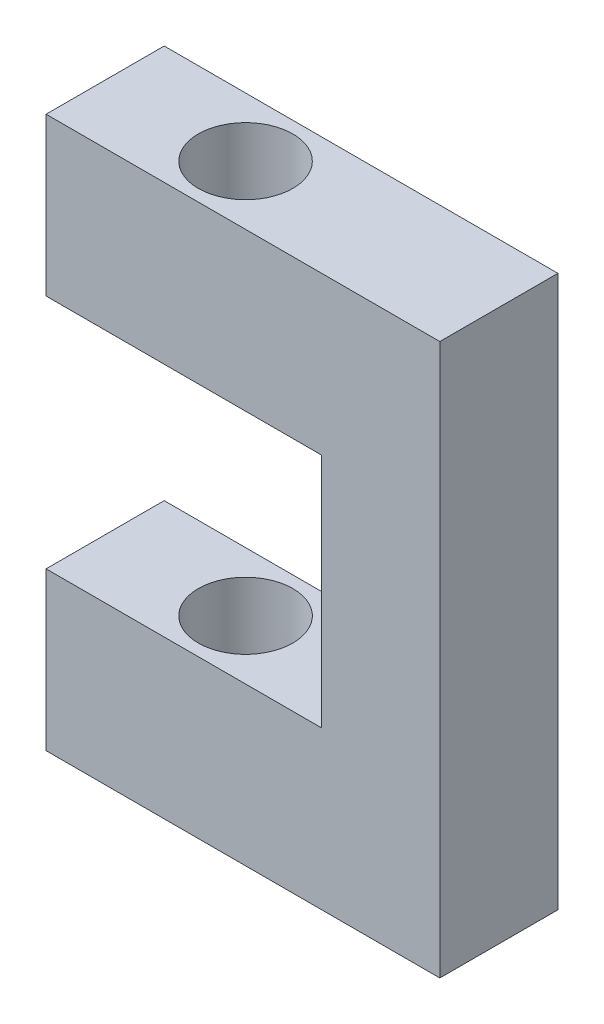
ISO-10303-21;
HEADER;
FILE_DESCRIPTION(('STEP AP214'),'2;1');
FILE_NAME('part.step','',(''),(''),'','','');
FILE_SCHEMA(('AUTOMOTIVE_DESIGN { 1 0 10303 214 1 1 1 1 }'));
ENDSEC;
DATA;
#1=APPLICATION_CONTEXT('core data for automotive mechanical design processes');
#2=APPLICATION_PROTOCOL_DEFINITION('international standard','automotive_design',2000,#1);
#3=PRODUCT_CONTEXT('',#1,'mechanical');
#4=PRODUCT('Part','Part','',(#3));
#5=PRODUCT_RELATED_PRODUCT_CATEGORY('part','',(#4));
#6=PRODUCT_DEFINITION_FORMATION('','',#4);
#7=PRODUCT_DEFINITION_CONTEXT('part definition',#1,'design');
#8=PRODUCT_DEFINITION('design','',#6,#7);
#9=PRODUCT_DEFINITION_SHAPE('','',#8);
#10=(LENGTH_UNIT() NAMED_UNIT(*) SI_UNIT(.MILLI.,.METRE.));
#11=(NAMED_UNIT(*) PLANE_ANGLE_UNIT() SI_UNIT($,.RADIAN.));
#12=(NAMED_UNIT(*) SI_UNIT($,.STERADIAN.) SOLID_ANGLE_UNIT());
#13=UNCERTAINTY_MEASURE_WITH_UNIT(LENGTH_MEASURE(1.E-05),#10,'distance_accuracy_value','');
#14=(GEOMETRIC_REPRESENTATION_CONTEXT(3) GLOBAL_UNCERTAINTY_ASSIGNED_CONTEXT((#13)) GLOBAL_UNIT_ASSIGNED_CONTEXT((#10,
#11,#12)) REPRESENTATION_CONTEXT('',''));
#15=CARTESIAN_POINT('',(0.,0.,0.));
#16=DIRECTION('',(0.,0.,1.));
#17=DIRECTION('',(1.,0.,0.));
#18=AXIS2_PLACEMENT_3D('',#15,#16,#17);
#19=CARTESIAN_POINT('',(0.,0.,15.));
#20=DIRECTION('',(1.,0.,0.));
#21=DIRECTION('',(0.,1.,0.));
#22=AXIS2_PLACEMENT_3D('',#19,#20,#21);
#23=PLANE('',#22);
#24=DIRECTION('',(0.,-1.,0.));
#25=VECTOR('',#24,1.);
#26=CARTESIAN_POINT('',(0.,0.,0.));
#27=LINE('',#26,#25);
#28=CARTESIAN_POINT('',(0.,0.,0.));
#29=VERTEX_POINT('',#28);
#30=CARTESIAN_POINT('',(0.,-20.,0.));
#31=VERTEX_POINT('',#30);
#32=EDGE_CURVE('E129',#29,#31,#27,.T.);
#33=ORIENTED_EDGE('',*,*,#32,.T.);
#34=DIRECTION('',(0.,0.,-1.));
#35=VECTOR('',#34,1.);
#36=CARTESIAN_POINT('',(0.,-20.,15.));
#37=LINE('',#36,#35);
#38=CARTESIAN_POINT('',(0.,-20.,15.));
#39=VERTEX_POINT('',#38);
#40=EDGE_CURVE('E11',#39,#31,#37,.T.);
#41=ORIENTED_EDGE('',*,*,#40,.F.);
#42=DIRECTION('',(0.,-1.,0.));
#43=VECTOR('',#42,1.);
#44=CARTESIAN_POINT('',(0.,0.,15.));
#45=LINE('',#44,#43);
#46=CARTESIAN_POINT('',(0.,0.,15.));
#47=VERTEX_POINT('',#46);
#48=EDGE_CURVE('E144',#47,#39,#45,.T.);
#49=ORIENTED_EDGE('',*,*,#48,.F.);
#50=DIRECTION('',(0.,0.,-1.));
#51=VECTOR('',#50,1.);
#52=CARTESIAN_POINT('',(0.,0.,15.));
#53=LINE('',#52,#51);
#54=EDGE_CURVE('E125',#47,#29,#53,.T.);
#55=ORIENTED_EDGE('',*,*,#54,.T.);
#56=EDGE_LOOP('',(#33,#41,#49,#55));
#57=FACE_BOUND('',#56,.T.);
#58=ADVANCED_FACE('F33',(#57),#23,.F.);
#59=CARTESIAN_POINT('',(0.,-20.,15.));
#60=DIRECTION('',(0.,1.,0.));
#61=DIRECTION('',(0.,0.,1.));
#62=AXIS2_PLACEMENT_3D('',#59,#60,#61);
#63=PLANE('',#62);
#64=CARTESIAN_POINT('',(17.8319150181423,-20.,7.5));
#65=DIRECTION('',(0.,1.,0.));
#66=DIRECTION('',(0.,0.,1.));
#67=AXIS2_PLACEMENT_3D('',#64,#65,#66);
#68=CIRCLE('',#67,6.);
#69=CARTESIAN_POINT('',(17.8319150181423,-20.,13.5));
#70=VERTEX_POINT('',#69);
#71=EDGE_CURVE('E133',#70,#70,#68,.T.);
#72=ORIENTED_EDGE('',*,*,#71,.T.);
#73=EDGE_LOOP('',(#72));
#74=FACE_BOUND('',#73,.T.);
#75=DIRECTION('',(1.,0.,0.));
#76=VECTOR('',#75,1.);
#77=CARTESIAN_POINT('',(0.,-20.,0.));
#78=LINE('',#77,#76);
#79=CARTESIAN_POINT('',(35.,-20.,0.));
#80=VERTEX_POINT('',#79);
#81=EDGE_CURVE('E132',#31,#80,#78,.T.);
#82=ORIENTED_EDGE('',*,*,#81,.T.);
#83=DIRECTION('',(0.,0.,-1.));
#84=VECTOR('',#83,1.);
#85=CARTESIAN_POINT('',(35.,-20.,15.));
#86=LINE('',#85,#84);
#87=CARTESIAN_POINT('',(35.,-20.,15.));
#88=VERTEX_POINT('',#87);
#89=EDGE_CURVE('E41',#88,#80,#86,.T.);
#90=ORIENTED_EDGE('',*,*,#89,.F.);
#91=DIRECTION('',(1.,0.,0.));
#92=VECTOR('',#91,1.);
#93=CARTESIAN_POINT('',(0.,-20.,15.));
#94=LINE('',#93,#92);
#95=EDGE_CURVE('E92',#39,#88,#94,.T.);
#96=ORIENTED_EDGE('',*,*,#95,.F.);
#97=ORIENTED_EDGE('',*,*,#40,.T.);
#98=EDGE_LOOP('',(#82,#90,#96,#97));
#99=FACE_BOUND('',#98,.T.);
#100=ADVANCED_FACE('F203',(#74,#99),#63,.F.);
#101=CARTESIAN_POINT('',(35.,-20.,15.));
#102=DIRECTION('',(1.,0.,0.));
#103=DIRECTION('',(0.,0.,-1.));
#104=AXIS2_PLACEMENT_3D('',#101,#102,#103);
#105=PLANE('',#104);
#106=DIRECTION('',(0.,-1.,0.));
#107=VECTOR('',#106,1.);
#108=CARTESIAN_POINT('',(35.,-20.,0.));
#109=LINE('',#108,#107);
#110=CARTESIAN_POINT('',(35.,-50.,0.));
#111=VERTEX_POINT('',#110);
#112=EDGE_CURVE('E135',#80,#111,#109,.T.);
#113=ORIENTED_EDGE('',*,*,#112,.T.);
#114=DIRECTION('',(0.,0.,-1.));
#115=VECTOR('',#114,1.);
#116=CARTESIAN_POINT('',(35.,-50.,15.));
#117=LINE('',#116,#115);
#118=CARTESIAN_POINT('',(35.,-50.,15.));
#119=VERTEX_POINT('',#118);
#120=EDGE_CURVE('E151',#119,#111,#117,.T.);
#121=ORIENTED_EDGE('',*,*,#120,.F.);
#122=DIRECTION('',(0.,-1.,0.));
#123=VECTOR('',#122,1.);
#124=CARTESIAN_POINT('',(35.,-20.,15.));
#125=LINE('',#124,#123);
#126=EDGE_CURVE('E159',#88,#119,#125,.T.);
#127=ORIENTED_EDGE('',*,*,#126,.F.);
#128=ORIENTED_EDGE('',*,*,#89,.T.);
#129=EDGE_LOOP('',(#113,#121,#127,#128));
#130=FACE_BOUND('',#129,.T.);
#131=ADVANCED_FACE('F157',(#130),#105,.F.);
#132=CARTESIAN_POINT('',(35.,-50.,15.));
#133=DIRECTION('',(0.,-1.,0.));
#134=DIRECTION('',(1.,0.,0.));
#135=AXIS2_PLACEMENT_3D('',#132,#133,#134);
#136=PLANE('',#135);
#137=CARTESIAN_POINT('',(17.8319150181423,-50.,7.5));
#138=DIRECTION('',(0.,-1.,0.));
#139=DIRECTION('',(1.,0.,0.));
#140=AXIS2_PLACEMENT_3D('',#137,#138,#139);
#141=CIRCLE('',#140,6.);
#142=CARTESIAN_POINT('',(23.8319150181423,-50.,7.5));
#143=VERTEX_POINT('',#142);
#144=EDGE_CURVE('E179',#143,#143,#141,.T.);
#145=ORIENTED_EDGE('',*,*,#144,.T.);
#146=EDGE_LOOP('',(#145));
#147=FACE_BOUND('',#146,.T.);
#148=DIRECTION('',(-1.,0.,0.));
#149=VECTOR('',#148,1.);
#150=CARTESIAN_POINT('',(35.,-50.,0.));
#151=LINE('',#150,#149);
#152=CARTESIAN_POINT('',(0.,-50.,0.));
#153=VERTEX_POINT('',#152);
#154=EDGE_CURVE('E137',#111,#153,#151,.T.);
#155=ORIENTED_EDGE('',*,*,#154,.T.);
#156=DIRECTION('',(0.,0.,-1.));
#157=VECTOR('',#156,1.);
#158=CARTESIAN_POINT('',(0.,-50.,15.));
#159=LINE('',#158,#157);
#160=CARTESIAN_POINT('',(0.,-50.,15.));
#161=VERTEX_POINT('',#160);
#162=EDGE_CURVE('E148',#161,#153,#159,.T.);
#163=ORIENTED_EDGE('',*,*,#162,.F.);
#164=DIRECTION('',(-1.,0.,0.));
#165=VECTOR('',#164,1.);
#166=CARTESIAN_POINT('',(35.,-50.,15.));
#167=LINE('',#166,#165);
#168=EDGE_CURVE('E171',#119,#161,#167,.T.);
#169=ORIENTED_EDGE('',*,*,#168,.F.);
#170=ORIENTED_EDGE('',*,*,#120,.T.);
#171=EDGE_LOOP('',(#155,#163,#169,#170));
#172=FACE_BOUND('',#171,.T.);
#173=ADVANCED_FACE('F167',(#147,#172),#136,.F.);
#174=CARTESIAN_POINT('',(0.,-50.,15.));
#175=DIRECTION('',(1.,0.,0.));
#176=DIRECTION('',(0.,1.,0.));
#177=AXIS2_PLACEMENT_3D('',#174,#175,#176);
#178=PLANE('',#177);
#179=DIRECTION('',(0.,-1.,0.));
#180=VECTOR('',#179,1.);
#181=CARTESIAN_POINT('',(0.,-50.,0.));
#182=LINE('',#181,#180);
#183=CARTESIAN_POINT('',(0.,-70.,0.));
#184=VERTEX_POINT('',#183);
#185=EDGE_CURVE('E139',#153,#184,#182,.T.);
#186=ORIENTED_EDGE('',*,*,#185,.T.);
#187=DIRECTION('',(0.,0.,-1.));
#188=VECTOR('',#187,1.);
#189=CARTESIAN_POINT('',(0.,-70.,15.));
#190=LINE('',#189,#188);
#191=CARTESIAN_POINT('',(0.,-70.,15.));
#192=VERTEX_POINT('',#191);
#193=EDGE_CURVE('E120',#192,#184,#190,.T.);
#194=ORIENTED_EDGE('',*,*,#193,.F.);
#195=DIRECTION('',(0.,-1.,0.));
#196=VECTOR('',#195,1.);
#197=CARTESIAN_POINT('',(0.,-50.,15.));
#198=LINE('',#197,#196);
#199=EDGE_CURVE('E111',#161,#192,#198,.T.);
#200=ORIENTED_EDGE('',*,*,#199,.F.);
#201=ORIENTED_EDGE('',*,*,#162,.T.);
#202=EDGE_LOOP('',(#186,#194,#200,#201));
#203=FACE_BOUND('',#202,.T.);
#204=ADVANCED_FACE('F170',(#203),#178,.F.);
#205=CARTESIAN_POINT('',(50.,-70.,15.));
#206=DIRECTION('',(0.,1.,0.));
#207=DIRECTION('',(-1.,0.,0.));
#208=AXIS2_PLACEMENT_3D('',#205,#206,#207);
#209=PLANE('',#208);
#210=CARTESIAN_POINT('',(17.8319150181423,-70.,7.5));
#211=DIRECTION('',(0.,1.,0.));
#212=DIRECTION('',(-1.,0.,0.));
#213=AXIS2_PLACEMENT_3D('',#210,#211,#212);
#214=CIRCLE('',#213,6.);
#215=CARTESIAN_POINT('',(11.8319150181423,-70.,7.5));
#216=VERTEX_POINT('',#215);
#217=EDGE_CURVE('E182',#216,#216,#214,.T.);
#218=ORIENTED_EDGE('',*,*,#217,.T.);
#219=EDGE_LOOP('',(#218));
#220=FACE_BOUND('',#219,.T.);
#221=DIRECTION('',(1.,0.,0.));
#222=VECTOR('',#221,1.);
#223=CARTESIAN_POINT('',(50.,-70.,0.));
#224=LINE('',#223,#222);
#225=CARTESIAN_POINT('',(50.,-70.,0.));
#226=VERTEX_POINT('',#225);
#227=EDGE_CURVE('E119',#184,#226,#224,.T.);
#228=ORIENTED_EDGE('',*,*,#227,.T.);
#229=DIRECTION('',(0.,0.,-1.));
#230=VECTOR('',#229,1.);
#231=CARTESIAN_POINT('',(50.,-70.,15.));
#232=LINE('',#231,#230);
#233=CARTESIAN_POINT('',(50.,-70.,15.));
#234=VERTEX_POINT('',#233);
#235=EDGE_CURVE('E116',#234,#226,#232,.T.);
#236=ORIENTED_EDGE('',*,*,#235,.F.);
#237=DIRECTION('',(1.,0.,0.));
#238=VECTOR('',#237,1.);
#239=CARTESIAN_POINT('',(50.,-70.,15.));
#240=LINE('',#239,#238);
#241=EDGE_CURVE('E105',#192,#234,#240,.T.);
#242=ORIENTED_EDGE('',*,*,#241,.F.);
#243=ORIENTED_EDGE('',*,*,#193,.T.);
#244=EDGE_LOOP('',(#228,#236,#242,#243));
#245=FACE_BOUND('',#244,.T.);
#246=ADVANCED_FACE('F117',(#220,#245),#209,.F.);
#247=CARTESIAN_POINT('',(50.,0.,15.));
#248=DIRECTION('',(-1.,0.,0.));
#249=DIRECTION('',(0.,0.,1.));
#250=AXIS2_PLACEMENT_3D('',#247,#248,#249);
#251=PLANE('',#250);
#252=DIRECTION('',(0.,1.,0.));
#253=VECTOR('',#252,1.);
#254=CARTESIAN_POINT('',(50.,0.,0.));
#255=LINE('',#254,#253);
#256=CARTESIAN_POINT('',(50.,0.,0.));
#257=VERTEX_POINT('',#256);
#258=EDGE_CURVE('E78',#226,#257,#255,.T.);
#259=ORIENTED_EDGE('',*,*,#258,.T.);
#260=DIRECTION('',(0.,0.,-1.));
#261=VECTOR('',#260,1.);
#262=CARTESIAN_POINT('',(50.,0.,15.));
#263=LINE('',#262,#261);
#264=CARTESIAN_POINT('',(50.,0.,15.));
#265=VERTEX_POINT('',#264);
#266=EDGE_CURVE('E121',#265,#257,#263,.T.);
#267=ORIENTED_EDGE('',*,*,#266,.F.);
#268=DIRECTION('',(0.,1.,0.));
#269=VECTOR('',#268,1.);
#270=CARTESIAN_POINT('',(50.,0.,15.));
#271=LINE('',#270,#269);
#272=EDGE_CURVE('E109',#234,#265,#271,.T.);
#273=ORIENTED_EDGE('',*,*,#272,.F.);
#274=ORIENTED_EDGE('',*,*,#235,.T.);
#275=EDGE_LOOP('',(#259,#267,#273,#274));
#276=FACE_BOUND('',#275,.T.);
#277=ADVANCED_FACE('F123',(#276),#251,.F.);
#278=CARTESIAN_POINT('',(0.,0.,15.));
#279=DIRECTION('',(0.,-1.,0.));
#280=DIRECTION('',(0.,0.,-1.));
#281=AXIS2_PLACEMENT_3D('',#278,#279,#280);
#282=PLANE('',#281);
#283=CARTESIAN_POINT('',(17.8319150181423,0.,7.5));
#284=DIRECTION('',(0.,1.,0.));
#285=DIRECTION('',(0.,0.,1.));
#286=AXIS2_PLACEMENT_3D('',#283,#284,#285);
#287=CIRCLE('',#286,6.);
#288=CARTESIAN_POINT('',(17.8319150181423,0.,13.5));
#289=VERTEX_POINT('',#288);
#290=EDGE_CURVE('E185',#289,#289,#287,.T.);
#291=ORIENTED_EDGE('',*,*,#290,.F.);
#292=EDGE_LOOP('',(#291));
#293=FACE_BOUND('',#292,.T.);
#294=DIRECTION('',(-1.,0.,0.));
#295=VECTOR('',#294,1.);
#296=CARTESIAN_POINT('',(0.,0.,0.));
#297=LINE('',#296,#295);
#298=EDGE_CURVE('E84',#257,#29,#297,.T.);
#299=ORIENTED_EDGE('',*,*,#298,.T.);
#300=ORIENTED_EDGE('',*,*,#54,.F.);
#301=DIRECTION('',(-1.,0.,0.));
#302=VECTOR('',#301,1.);
#303=CARTESIAN_POINT('',(0.,0.,15.));
#304=LINE('',#303,#302);
#305=EDGE_CURVE('E49',#265,#47,#304,.T.);
#306=ORIENTED_EDGE('',*,*,#305,.F.);
#307=ORIENTED_EDGE('',*,*,#266,.T.);
#308=EDGE_LOOP('',(#299,#300,#306,#307));
#309=FACE_BOUND('',#308,.T.);
#310=ADVANCED_FACE('F192',(#293,#309),#282,.F.);
#311=CARTESIAN_POINT('',(0.,0.,15.));
#312=DIRECTION('',(0.,0.,1.));
#313=DIRECTION('',(1.,0.,0.));
#314=AXIS2_PLACEMENT_3D('',#311,#312,#313);
#315=PLANE('',#314);
#316=ORIENTED_EDGE('',*,*,#48,.T.);
#317=ORIENTED_EDGE('',*,*,#95,.T.);
#318=ORIENTED_EDGE('',*,*,#126,.T.);
#319=ORIENTED_EDGE('',*,*,#168,.T.);
#320=ORIENTED_EDGE('',*,*,#199,.T.);
#321=ORIENTED_EDGE('',*,*,#241,.T.);
#322=ORIENTED_EDGE('',*,*,#272,.T.);
#323=ORIENTED_EDGE('',*,*,#305,.T.);
#324=EDGE_LOOP('',(#316,#317,#318,#319,#320,#321,#322,#323));
#325=FACE_BOUND('',#324,.T.);
#326=ADVANCED_FACE('F107',(#325),#315,.T.);
#327=CARTESIAN_POINT('',(0.,0.,0.));
#328=DIRECTION('',(0.,0.,1.));
#329=DIRECTION('',(1.,0.,0.));
#330=AXIS2_PLACEMENT_3D('',#327,#328,#329);
#331=PLANE('',#330);
#332=ORIENTED_EDGE('',*,*,#32,.F.);
#333=ORIENTED_EDGE('',*,*,#298,.F.);
#334=ORIENTED_EDGE('',*,*,#258,.F.);
#335=ORIENTED_EDGE('',*,*,#227,.F.);
#336=ORIENTED_EDGE('',*,*,#185,.F.);
#337=ORIENTED_EDGE('',*,*,#154,.F.);
#338=ORIENTED_EDGE('',*,*,#112,.F.);
#339=ORIENTED_EDGE('',*,*,#81,.F.);
#340=EDGE_LOOP('',(#332,#333,#334,#335,#336,#337,#338,#339));
#341=FACE_BOUND('',#340,.T.);
#342=ADVANCED_FACE('F163',(#341),#331,.F.);
#343=CARTESIAN_POINT('',(17.8319150181423,-81.,7.5));
#344=DIRECTION('',(0.,1.,0.));
#345=DIRECTION('',(0.,0.,1.));
#346=AXIS2_PLACEMENT_3D('',#343,#344,#345);
#347=CYLINDRICAL_SURFACE('',#346,6.);
#348=ORIENTED_EDGE('',*,*,#290,.T.);
#349=EDGE_LOOP('',(#348));
#350=FACE_BOUND('',#349,.T.);
#351=ORIENTED_EDGE('',*,*,#71,.F.);
#352=EDGE_LOOP('',(#351));
#353=FACE_BOUND('',#352,.T.);
#354=ADVANCED_FACE('F189',(#350,#353),#347,.F.);
#355=ORIENTED_EDGE('',*,*,#217,.F.);
#356=EDGE_LOOP('',(#355));
#357=FACE_BOUND('',#356,.T.);
#358=ORIENTED_EDGE('',*,*,#144,.F.);
#359=EDGE_LOOP('',(#358));
#360=FACE_BOUND('',#359,.T.);
#361=ADVANCED_FACE('F227',(#357,#360),#347,.F.);
#362=CLOSED_SHELL('',(#58,#100,#131,#173,#204,#246,#277,#310,#326,#342,#354,#361));
#363=MANIFOLD_SOLID_BREP('B2',#362);
#364=ADVANCED_BREP_SHAPE_REPRESENTATION('',(#18,#363),#14);
#365=SHAPE_DEFINITION_REPRESENTATION(#9,#364);
ENDSEC;
END-ISO-10303-21;
